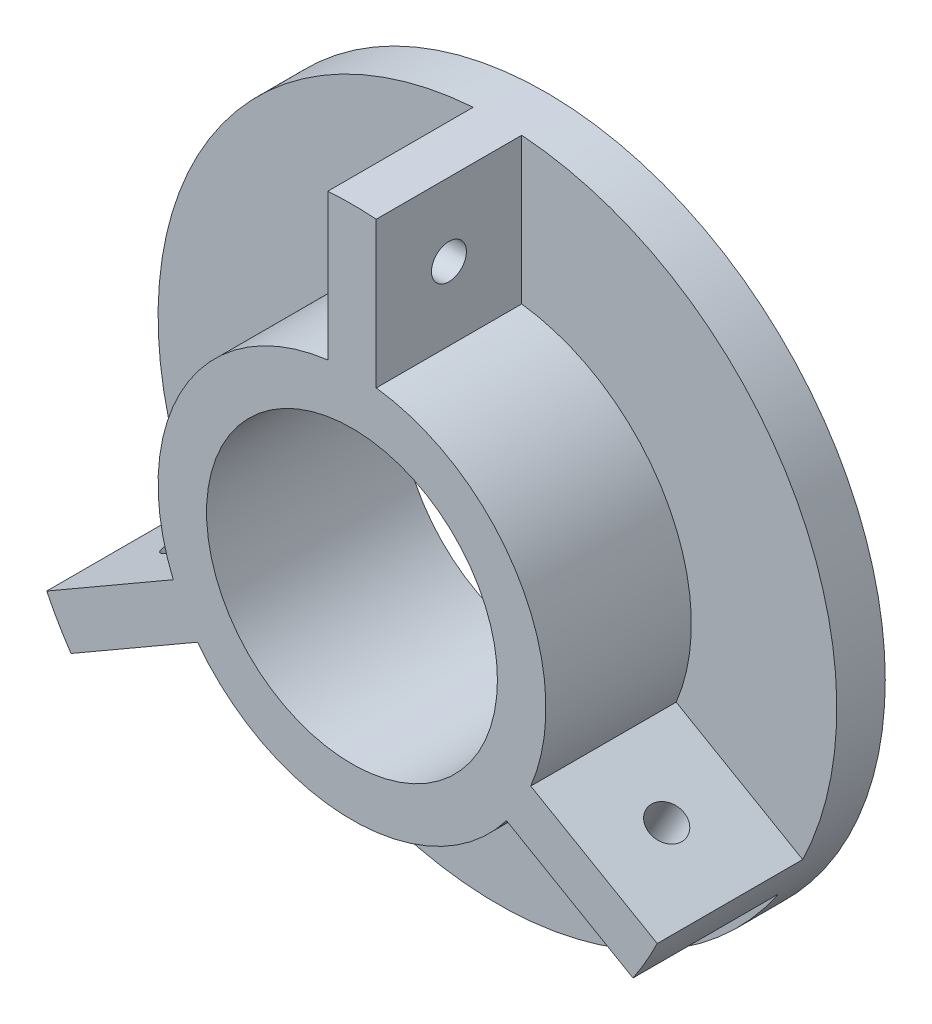
ISO-10303-21;
HEADER;
FILE_DESCRIPTION(('STEP AP214'),'2;1');
FILE_NAME('part.step','',(''),(''),'','','');
FILE_SCHEMA(('AUTOMOTIVE_DESIGN { 1 0 10303 214 1 1 1 1 }'));
ENDSEC;
DATA;
#1=APPLICATION_CONTEXT('core data for automotive mechanical design processes');
#2=APPLICATION_PROTOCOL_DEFINITION('international standard','automotive_design',2000,#1);
#3=PRODUCT_CONTEXT('',#1,'mechanical');
#4=PRODUCT('Part','Part','',(#3));
#5=PRODUCT_RELATED_PRODUCT_CATEGORY('part','',(#4));
#6=PRODUCT_DEFINITION_FORMATION('','',#4);
#7=PRODUCT_DEFINITION_CONTEXT('part definition',#1,'design');
#8=PRODUCT_DEFINITION('design','',#6,#7);
#9=PRODUCT_DEFINITION_SHAPE('','',#8);
#10=(LENGTH_UNIT() NAMED_UNIT(*) SI_UNIT(.MILLI.,.METRE.));
#11=(NAMED_UNIT(*) PLANE_ANGLE_UNIT() SI_UNIT($,.RADIAN.));
#12=(NAMED_UNIT(*) SI_UNIT($,.STERADIAN.) SOLID_ANGLE_UNIT());
#13=UNCERTAINTY_MEASURE_WITH_UNIT(LENGTH_MEASURE(1.E-05),#10,'distance_accuracy_value','');
#14=(GEOMETRIC_REPRESENTATION_CONTEXT(3) GLOBAL_UNCERTAINTY_ASSIGNED_CONTEXT((#13)) GLOBAL_UNIT_ASSIGNED_CONTEXT((#10,
#11,#12)) REPRESENTATION_CONTEXT('',''));
#15=CARTESIAN_POINT('',(0.,0.,0.));
#16=DIRECTION('',(0.,0.,1.));
#17=DIRECTION('',(1.,0.,0.));
#18=AXIS2_PLACEMENT_3D('',#15,#16,#17);
#19=CARTESIAN_POINT('',(0.,0.,5.));
#20=DIRECTION('',(0.,0.,1.));
#21=DIRECTION('',(1.,0.,0.));
#22=AXIS2_PLACEMENT_3D('',#19,#20,#21);
#23=PLANE('',#22);
#24=DIRECTION('',(0.866025403784439,-0.5,0.));
#25=VECTOR('',#24,1.);
#26=CARTESIAN_POINT('',(-1.25000000000313,-2.16506350946653,5.));
#27=LINE('',#26,#25);
#28=CARTESIAN_POINT('',(15.9337652188014,-12.0861149842338,5.));
#29=VERTEX_POINT('',#28);
#30=CARTESIAN_POINT('',(28.983466556116,-19.6203635641775,5.));
#31=VERTEX_POINT('',#30);
#32=EDGE_CURVE('E49',#29,#31,#27,.T.);
#33=ORIENTED_EDGE('',*,*,#32,.F.);
#34=CARTESIAN_POINT('',(0.,0.,5.));
#35=DIRECTION('',(0.,0.,1.));
#36=DIRECTION('',(1.,0.,0.));
#37=AXIS2_PLACEMENT_3D('',#34,#35,#36);
#38=CIRCLE('',#37,19.9989762102908);
#39=CARTESIAN_POINT('',(-15.9337652188014,-12.0861149842338,5.));
#40=VERTEX_POINT('',#39);
#41=EDGE_CURVE('E53',#40,#29,#38,.T.);
#42=ORIENTED_EDGE('',*,*,#41,.F.);
#43=DIRECTION('',(-0.866025403784438,-0.5,0.));
#44=VECTOR('',#43,1.);
#45=CARTESIAN_POINT('',(1.25000000000313,-2.16506350946652,5.));
#46=LINE('',#45,#44);
#47=CARTESIAN_POINT('',(-28.983466556116,-19.6203635641775,5.));
#48=VERTEX_POINT('',#47);
#49=EDGE_CURVE('E266',#40,#48,#46,.T.);
#50=ORIENTED_EDGE('',*,*,#49,.T.);
#51=CARTESIAN_POINT('',(0.,0.,5.));
#52=DIRECTION('',(0.,0.,1.));
#53=DIRECTION('',(1.,0.,0.));
#54=AXIS2_PLACEMENT_3D('',#51,#52,#53);
#55=CIRCLE('',#54,35.);
#56=EDGE_CURVE('E41',#48,#31,#55,.T.);
#57=ORIENTED_EDGE('',*,*,#56,.T.);
#58=EDGE_LOOP('',(#33,#42,#50,#57));
#59=FACE_BOUND('',#58,.T.);
#60=ADVANCED_FACE('F32',(#59),#23,.T.);
#61=CARTESIAN_POINT('',(18.4337652188014,-7.7559879653132,5.));
#62=VERTEX_POINT('',#61);
#63=CARTESIAN_POINT('',(2.5,19.8421029495308,5.));
#64=VERTEX_POINT('',#63);
#65=EDGE_CURVE('E146',#62,#64,#38,.T.);
#66=ORIENTED_EDGE('',*,*,#65,.F.);
#67=DIRECTION('',(0.866025403784439,-0.5,0.));
#68=VECTOR('',#67,1.);
#69=CARTESIAN_POINT('',(1.24999999999687,2.16506350945567,5.));
#70=LINE('',#69,#68);
#71=CARTESIAN_POINT('',(31.4834665561168,-15.2902365452557,5.));
#72=VERTEX_POINT('',#71);
#73=EDGE_CURVE('E173',#62,#72,#70,.T.);
#74=ORIENTED_EDGE('',*,*,#73,.T.);
#75=CARTESIAN_POINT('',(2.5,34.9106001094224,5.));
#76=VERTEX_POINT('',#75);
#77=EDGE_CURVE('E160',#72,#76,#55,.T.);
#78=ORIENTED_EDGE('',*,*,#77,.T.);
#79=DIRECTION('',(0.,1.,0.));
#80=VECTOR('',#79,1.);
#81=CARTESIAN_POINT('',(2.5,0.,5.));
#82=LINE('',#81,#80);
#83=EDGE_CURVE('E171',#64,#76,#82,.T.);
#84=ORIENTED_EDGE('',*,*,#83,.F.);
#85=EDGE_LOOP('',(#66,#74,#78,#84));
#86=FACE_BOUND('',#85,.T.);
#87=ADVANCED_FACE('F170',(#86),#23,.T.);
#88=DIRECTION('',(-0.866025403784438,-0.500000000000001,0.));
#89=VECTOR('',#88,1.);
#90=CARTESIAN_POINT('',(-1.24999999999687,2.16506350945567,5.));
#91=LINE('',#90,#89);
#92=CARTESIAN_POINT('',(-18.4337652188014,-7.75598796531321,5.));
#93=VERTEX_POINT('',#92);
#94=CARTESIAN_POINT('',(-31.4834665561168,-15.2902365452557,5.));
#95=VERTEX_POINT('',#94);
#96=EDGE_CURVE('E245',#93,#95,#91,.T.);
#97=ORIENTED_EDGE('',*,*,#96,.F.);
#98=CARTESIAN_POINT('',(-2.5,19.8421029495308,5.));
#99=VERTEX_POINT('',#98);
#100=EDGE_CURVE('E203',#99,#93,#38,.T.);
#101=ORIENTED_EDGE('',*,*,#100,.F.);
#102=DIRECTION('',(0.,1.,0.));
#103=VECTOR('',#102,1.);
#104=CARTESIAN_POINT('',(-2.5,0.,5.));
#105=LINE('',#104,#103);
#106=CARTESIAN_POINT('',(-2.5,34.9106001094224,5.));
#107=VERTEX_POINT('',#106);
#108=EDGE_CURVE('E177',#99,#107,#105,.T.);
#109=ORIENTED_EDGE('',*,*,#108,.T.);
#110=EDGE_CURVE('E11',#107,#95,#55,.T.);
#111=ORIENTED_EDGE('',*,*,#110,.T.);
#112=EDGE_LOOP('',(#97,#101,#109,#111));
#113=FACE_BOUND('',#112,.T.);
#114=ADVANCED_FACE('F305',(#113),#23,.T.);
#115=CARTESIAN_POINT('',(0.,0.,0.));
#116=DIRECTION('',(0.,0.,1.));
#117=DIRECTION('',(1.,0.,0.));
#118=AXIS2_PLACEMENT_3D('',#115,#116,#117);
#119=PLANE('',#118);
#120=CARTESIAN_POINT('',(0.,0.,0.));
#121=DIRECTION('',(0.,0.,1.));
#122=DIRECTION('',(1.,0.,0.));
#123=AXIS2_PLACEMENT_3D('',#120,#121,#122);
#124=CIRCLE('',#123,35.);
#125=CARTESIAN_POINT('',(35.,0.,0.));
#126=VERTEX_POINT('',#125);
#127=EDGE_CURVE('E150',#126,#126,#124,.T.);
#128=ORIENTED_EDGE('',*,*,#127,.F.);
#129=EDGE_LOOP('',(#128));
#130=FACE_BOUND('',#129,.T.);
#131=CARTESIAN_POINT('',(0.,0.,0.));
#132=DIRECTION('',(0.,0.,1.));
#133=DIRECTION('',(1.,0.,0.));
#134=AXIS2_PLACEMENT_3D('',#131,#132,#133);
#135=CIRCLE('',#134,15.);
#136=CARTESIAN_POINT('',(15.,0.,0.));
#137=VERTEX_POINT('',#136);
#138=EDGE_CURVE('E147',#137,#137,#135,.T.);
#139=ORIENTED_EDGE('',*,*,#138,.T.);
#140=EDGE_LOOP('',(#139));
#141=FACE_BOUND('',#140,.T.);
#142=ADVANCED_FACE('F311',(#130,#141),#119,.F.);
#143=CARTESIAN_POINT('',(0.,0.,5.));
#144=DIRECTION('',(0.,0.,-1.));
#145=DIRECTION('',(-1.,0.,0.));
#146=AXIS2_PLACEMENT_3D('',#143,#144,#145);
#147=CYLINDRICAL_SURFACE('',#146,35.);
#148=ORIENTED_EDGE('',*,*,#110,.F.);
#149=DIRECTION('',(0.,0.,-1.));
#150=VECTOR('',#149,1.);
#151=CARTESIAN_POINT('',(-2.5,34.9106001094224,20.));
#152=LINE('',#151,#150);
#153=CARTESIAN_POINT('',(-2.5,34.9106001094224,20.));
#154=VERTEX_POINT('',#153);
#155=EDGE_CURVE('E152',#154,#107,#152,.T.);
#156=ORIENTED_EDGE('',*,*,#155,.F.);
#157=CARTESIAN_POINT('',(0.,0.,20.));
#158=DIRECTION('',(0.,0.,1.));
#159=DIRECTION('',(1.,0.,0.));
#160=AXIS2_PLACEMENT_3D('',#157,#158,#159);
#161=CIRCLE('',#160,35.);
#162=CARTESIAN_POINT('',(2.5,34.9106001094224,20.));
#163=VERTEX_POINT('',#162);
#164=EDGE_CURVE('E131',#163,#154,#161,.T.);
#165=ORIENTED_EDGE('',*,*,#164,.F.);
#166=DIRECTION('',(0.,0.,-1.));
#167=VECTOR('',#166,1.);
#168=CARTESIAN_POINT('',(2.5,34.9106001094224,20.));
#169=LINE('',#168,#167);
#170=EDGE_CURVE('E128',#163,#76,#169,.T.);
#171=ORIENTED_EDGE('',*,*,#170,.T.);
#172=ORIENTED_EDGE('',*,*,#77,.F.);
#173=DIRECTION('',(0.,0.,-1.));
#174=VECTOR('',#173,1.);
#175=CARTESIAN_POINT('',(31.4834665561168,-15.2902365452557,20.));
#176=LINE('',#175,#174);
#177=CARTESIAN_POINT('',(31.4834665561168,-15.2902365452557,20.));
#178=VERTEX_POINT('',#177);
#179=EDGE_CURVE('E214',#178,#72,#176,.T.);
#180=ORIENTED_EDGE('',*,*,#179,.F.);
#181=CARTESIAN_POINT('',(0.,0.,20.));
#182=DIRECTION('',(0.,0.,1.));
#183=DIRECTION('',(1.,0.,0.));
#184=AXIS2_PLACEMENT_3D('',#181,#182,#183);
#185=CIRCLE('',#184,35.);
#186=CARTESIAN_POINT('',(28.983466556116,-19.6203635641775,20.));
#187=VERTEX_POINT('',#186);
#188=EDGE_CURVE('E197',#187,#178,#185,.T.);
#189=ORIENTED_EDGE('',*,*,#188,.F.);
#190=DIRECTION('',(0.,0.,-1.));
#191=VECTOR('',#190,1.);
#192=CARTESIAN_POINT('',(28.983466556116,-19.6203635641775,20.));
#193=LINE('',#192,#191);
#194=EDGE_CURVE('E216',#187,#31,#193,.T.);
#195=ORIENTED_EDGE('',*,*,#194,.T.);
#196=ORIENTED_EDGE('',*,*,#56,.F.);
#197=DIRECTION('',(0.,0.,-1.));
#198=VECTOR('',#197,1.);
#199=CARTESIAN_POINT('',(-28.983466556116,-19.6203635641775,20.));
#200=LINE('',#199,#198);
#201=CARTESIAN_POINT('',(-28.983466556116,-19.6203635641775,20.));
#202=VERTEX_POINT('',#201);
#203=EDGE_CURVE('E228',#202,#48,#200,.T.);
#204=ORIENTED_EDGE('',*,*,#203,.F.);
#205=CARTESIAN_POINT('',(0.,0.,20.));
#206=DIRECTION('',(0.,0.,1.));
#207=DIRECTION('',(1.,0.,0.));
#208=AXIS2_PLACEMENT_3D('',#205,#206,#207);
#209=CIRCLE('',#208,35.);
#210=CARTESIAN_POINT('',(-31.4834665561168,-15.2902365452558,20.));
#211=VERTEX_POINT('',#210);
#212=EDGE_CURVE('E190',#211,#202,#209,.T.);
#213=ORIENTED_EDGE('',*,*,#212,.F.);
#214=DIRECTION('',(0.,0.,-1.));
#215=VECTOR('',#214,1.);
#216=CARTESIAN_POINT('',(-31.4834665561168,-15.2902365452558,20.));
#217=LINE('',#216,#215);
#218=EDGE_CURVE('E231',#211,#95,#217,.T.);
#219=ORIENTED_EDGE('',*,*,#218,.T.);
#220=EDGE_LOOP('',(#148,#156,#165,#171,#172,#180,#189,#195,#196,#204,#213,#219));
#221=FACE_BOUND('',#220,.T.);
#222=ORIENTED_EDGE('',*,*,#127,.T.);
#223=EDGE_LOOP('',(#222));
#224=FACE_BOUND('',#223,.T.);
#225=ADVANCED_FACE('F34',(#221,#224),#147,.T.);
#226=CARTESIAN_POINT('',(0.,0.,5.));
#227=DIRECTION('',(0.,0.,-1.));
#228=DIRECTION('',(-1.,0.,0.));
#229=AXIS2_PLACEMENT_3D('',#226,#227,#228);
#230=CYLINDRICAL_SURFACE('',#229,15.);
#231=ORIENTED_EDGE('',*,*,#138,.F.);
#232=EDGE_LOOP('',(#231));
#233=FACE_BOUND('',#232,.T.);
#234=CARTESIAN_POINT('',(0.,0.,20.));
#235=DIRECTION('',(0.,0.,1.));
#236=DIRECTION('',(1.,0.,0.));
#237=AXIS2_PLACEMENT_3D('',#234,#235,#236);
#238=CIRCLE('',#237,15.);
#239=CARTESIAN_POINT('',(15.,0.,20.));
#240=VERTEX_POINT('',#239);
#241=EDGE_CURVE('E141',#240,#240,#238,.F.);
#242=ORIENTED_EDGE('',*,*,#241,.F.);
#243=EDGE_LOOP('',(#242));
#244=FACE_BOUND('',#243,.T.);
#245=ADVANCED_FACE('F342',(#233,#244),#230,.F.);
#246=CARTESIAN_POINT('',(0.,0.,20.));
#247=DIRECTION('',(0.,0.,-1.));
#248=DIRECTION('',(-1.,0.,0.));
#249=AXIS2_PLACEMENT_3D('',#246,#247,#248);
#250=CYLINDRICAL_SURFACE('',#249,19.9989762102908);
#251=ORIENTED_EDGE('',*,*,#65,.T.);
#252=DIRECTION('',(0.,0.,-1.));
#253=VECTOR('',#252,1.);
#254=CARTESIAN_POINT('',(2.5,19.8421029495308,20.));
#255=LINE('',#254,#253);
#256=CARTESIAN_POINT('',(2.5,19.8421029495308,20.));
#257=VERTEX_POINT('',#256);
#258=EDGE_CURVE('E125',#257,#64,#255,.T.);
#259=ORIENTED_EDGE('',*,*,#258,.F.);
#260=CARTESIAN_POINT('',(0.,0.,20.));
#261=DIRECTION('',(0.,0.,1.));
#262=DIRECTION('',(1.,0.,0.));
#263=AXIS2_PLACEMENT_3D('',#260,#261,#262);
#264=CIRCLE('',#263,19.9989762102908);
#265=CARTESIAN_POINT('',(18.4337652188014,-7.7559879653132,20.));
#266=VERTEX_POINT('',#265);
#267=EDGE_CURVE('E132',#266,#257,#264,.T.);
#268=ORIENTED_EDGE('',*,*,#267,.F.);
#269=DIRECTION('',(0.,0.,-1.));
#270=VECTOR('',#269,1.);
#271=CARTESIAN_POINT('',(18.4337652188014,-7.7559879653132,20.));
#272=LINE('',#271,#270);
#273=EDGE_CURVE('E200',#266,#62,#272,.T.);
#274=ORIENTED_EDGE('',*,*,#273,.T.);
#275=EDGE_LOOP('',(#251,#259,#268,#274));
#276=FACE_BOUND('',#275,.T.);
#277=ADVANCED_FACE('F145',(#276),#250,.T.);
#278=CARTESIAN_POINT('',(2.5,0.,20.));
#279=DIRECTION('',(-1.,0.,0.));
#280=DIRECTION('',(0.,0.,1.));
#281=AXIS2_PLACEMENT_3D('',#278,#279,#280);
#282=PLANE('',#281);
#283=CARTESIAN_POINT('',(2.5,27.3763515294766,12.5));
#284=DIRECTION('',(1.,0.,0.));
#285=DIRECTION('',(0.,0.,-1.));
#286=AXIS2_PLACEMENT_3D('',#283,#284,#285);
#287=CIRCLE('',#286,1.8);
#288=CARTESIAN_POINT('',(2.5,27.3763515294766,10.7));
#289=VERTEX_POINT('',#288);
#290=EDGE_CURVE('E202',#289,#289,#287,.T.);
#291=ORIENTED_EDGE('',*,*,#290,.F.);
#292=EDGE_LOOP('',(#291));
#293=FACE_BOUND('',#292,.T.);
#294=ORIENTED_EDGE('',*,*,#83,.T.);
#295=ORIENTED_EDGE('',*,*,#170,.F.);
#296=DIRECTION('',(0.,1.,0.));
#297=VECTOR('',#296,1.);
#298=CARTESIAN_POINT('',(2.5,0.,20.));
#299=LINE('',#298,#297);
#300=EDGE_CURVE('E120',#257,#163,#299,.T.);
#301=ORIENTED_EDGE('',*,*,#300,.F.);
#302=ORIENTED_EDGE('',*,*,#258,.T.);
#303=EDGE_LOOP('',(#294,#295,#301,#302));
#304=FACE_BOUND('',#303,.T.);
#305=ADVANCED_FACE('F123',(#293,#304),#282,.F.);
#306=CARTESIAN_POINT('',(-2.5,0.,20.));
#307=DIRECTION('',(-1.,0.,0.));
#308=DIRECTION('',(0.,0.,1.));
#309=AXIS2_PLACEMENT_3D('',#306,#307,#308);
#310=PLANE('',#309);
#311=CARTESIAN_POINT('',(-2.5,27.3763515294766,12.5));
#312=DIRECTION('',(-1.,0.,0.));
#313=DIRECTION('',(0.,0.,1.));
#314=AXIS2_PLACEMENT_3D('',#311,#312,#313);
#315=CIRCLE('',#314,1.8);
#316=CARTESIAN_POINT('',(-2.5,27.3763515294766,14.3));
#317=VERTEX_POINT('',#316);
#318=EDGE_CURVE('E273',#317,#317,#315,.F.);
#319=ORIENTED_EDGE('',*,*,#318,.T.);
#320=EDGE_LOOP('',(#319));
#321=FACE_BOUND('',#320,.T.);
#322=ORIENTED_EDGE('',*,*,#108,.F.);
#323=DIRECTION('',(0.,0.,-1.));
#324=VECTOR('',#323,1.);
#325=CARTESIAN_POINT('',(-2.5,19.8421029495308,20.));
#326=LINE('',#325,#324);
#327=CARTESIAN_POINT('',(-2.5,19.8421029495308,20.));
#328=VERTEX_POINT('',#327);
#329=EDGE_CURVE('E155',#328,#99,#326,.T.);
#330=ORIENTED_EDGE('',*,*,#329,.F.);
#331=DIRECTION('',(0.,1.,0.));
#332=VECTOR('',#331,1.);
#333=CARTESIAN_POINT('',(-2.5,0.,20.));
#334=LINE('',#333,#332);
#335=EDGE_CURVE('E184',#328,#154,#334,.T.);
#336=ORIENTED_EDGE('',*,*,#335,.T.);
#337=ORIENTED_EDGE('',*,*,#155,.T.);
#338=EDGE_LOOP('',(#322,#330,#336,#337));
#339=FACE_BOUND('',#338,.T.);
#340=ADVANCED_FACE('F253',(#321,#339),#310,.T.);
#341=ORIENTED_EDGE('',*,*,#100,.T.);
#342=DIRECTION('',(0.,0.,-1.));
#343=VECTOR('',#342,1.);
#344=CARTESIAN_POINT('',(-18.4337652188014,-7.75598796531321,20.));
#345=LINE('',#344,#343);
#346=CARTESIAN_POINT('',(-18.4337652188014,-7.75598796531321,20.));
#347=VERTEX_POINT('',#346);
#348=EDGE_CURVE('E229',#347,#93,#345,.T.);
#349=ORIENTED_EDGE('',*,*,#348,.F.);
#350=EDGE_CURVE('E144',#328,#347,#264,.T.);
#351=ORIENTED_EDGE('',*,*,#350,.F.);
#352=ORIENTED_EDGE('',*,*,#329,.T.);
#353=EDGE_LOOP('',(#341,#349,#351,#352));
#354=FACE_BOUND('',#353,.T.);
#355=ADVANCED_FACE('F257',(#354),#250,.T.);
#356=CARTESIAN_POINT('',(-1.24999999999687,2.16506350945567,20.));
#357=DIRECTION('',(0.500000000000001,-0.866025403784438,0.));
#358=DIRECTION('',(0.866025403784438,0.500000000000001,0.));
#359=AXIS2_PLACEMENT_3D('',#356,#357,#358);
#360=PLANE('',#359);
#361=CARTESIAN_POINT('',(-24.9586158874598,-11.5231122552769,12.5));
#362=DIRECTION('',(-0.499999999999992,0.866025403784443,0.));
#363=DIRECTION('',(0.,0.,-1.));
#364=AXIS2_PLACEMENT_3D('',#361,#362,#363);
#365=CIRCLE('',#364,1.8);
#366=CARTESIAN_POINT('',(-24.9586158874598,-11.5231122552769,10.7));
#367=VERTEX_POINT('',#366);
#368=EDGE_CURVE('E282',#367,#367,#365,.T.);
#369=ORIENTED_EDGE('',*,*,#368,.F.);
#370=EDGE_LOOP('',(#369));
#371=FACE_BOUND('',#370,.T.);
#372=ORIENTED_EDGE('',*,*,#96,.T.);
#373=ORIENTED_EDGE('',*,*,#218,.F.);
#374=DIRECTION('',(-0.866025403784438,-0.500000000000001,0.));
#375=VECTOR('',#374,1.);
#376=CARTESIAN_POINT('',(-1.24999999999687,2.16506350945567,20.));
#377=LINE('',#376,#375);
#378=EDGE_CURVE('E188',#347,#211,#377,.T.);
#379=ORIENTED_EDGE('',*,*,#378,.F.);
#380=ORIENTED_EDGE('',*,*,#348,.T.);
#381=EDGE_LOOP('',(#372,#373,#379,#380));
#382=FACE_BOUND('',#381,.T.);
#383=ADVANCED_FACE('F258',(#371,#382),#360,.F.);
#384=CARTESIAN_POINT('',(1.25000000000313,-2.16506350946652,20.));
#385=DIRECTION('',(0.5,-0.866025403784438,0.));
#386=DIRECTION('',(0.866025403784438,0.5,0.));
#387=AXIS2_PLACEMENT_3D('',#384,#385,#386);
#388=PLANE('',#387);
#389=CARTESIAN_POINT('',(-22.4586158874565,-15.8532392742048,12.5));
#390=DIRECTION('',(0.5,-0.866025403784438,0.));
#391=DIRECTION('',(0.866025403784438,0.5,0.));
#392=AXIS2_PLACEMENT_3D('',#389,#390,#391);
#393=CIRCLE('',#392,1.8);
#394=CARTESIAN_POINT('',(-20.8997701606446,-14.9532392742048,12.5));
#395=VERTEX_POINT('',#394);
#396=EDGE_CURVE('E285',#395,#395,#393,.F.);
#397=ORIENTED_EDGE('',*,*,#396,.T.);
#398=EDGE_LOOP('',(#397));
#399=FACE_BOUND('',#398,.T.);
#400=ORIENTED_EDGE('',*,*,#49,.F.);
#401=DIRECTION('',(0.,0.,-1.));
#402=VECTOR('',#401,1.);
#403=CARTESIAN_POINT('',(-15.9337652188014,-12.0861149842338,20.));
#404=LINE('',#403,#402);
#405=CARTESIAN_POINT('',(-15.9337652188014,-12.0861149842338,20.));
#406=VERTEX_POINT('',#405);
#407=EDGE_CURVE('E227',#406,#40,#404,.T.);
#408=ORIENTED_EDGE('',*,*,#407,.F.);
#409=DIRECTION('',(-0.866025403784438,-0.5,0.));
#410=VECTOR('',#409,1.);
#411=CARTESIAN_POINT('',(1.25000000000313,-2.16506350946652,20.));
#412=LINE('',#411,#410);
#413=EDGE_CURVE('E192',#406,#202,#412,.T.);
#414=ORIENTED_EDGE('',*,*,#413,.T.);
#415=ORIENTED_EDGE('',*,*,#203,.T.);
#416=EDGE_LOOP('',(#400,#408,#414,#415));
#417=FACE_BOUND('',#416,.T.);
#418=ADVANCED_FACE('F265',(#399,#417),#388,.T.);
#419=ORIENTED_EDGE('',*,*,#41,.T.);
#420=DIRECTION('',(0.,0.,-1.));
#421=VECTOR('',#420,1.);
#422=CARTESIAN_POINT('',(15.9337652188014,-12.0861149842338,20.));
#423=LINE('',#422,#421);
#424=CARTESIAN_POINT('',(15.9337652188014,-12.0861149842338,20.));
#425=VERTEX_POINT('',#424);
#426=EDGE_CURVE('E224',#425,#29,#423,.T.);
#427=ORIENTED_EDGE('',*,*,#426,.F.);
#428=EDGE_CURVE('E143',#406,#425,#264,.T.);
#429=ORIENTED_EDGE('',*,*,#428,.F.);
#430=ORIENTED_EDGE('',*,*,#407,.T.);
#431=EDGE_LOOP('',(#419,#427,#429,#430));
#432=FACE_BOUND('',#431,.T.);
#433=ADVANCED_FACE('F268',(#432),#250,.T.);
#434=CARTESIAN_POINT('',(-1.25000000000313,-2.16506350946653,20.));
#435=DIRECTION('',(0.5,0.866025403784439,0.));
#436=DIRECTION('',(-0.866025403784439,0.5,0.));
#437=AXIS2_PLACEMENT_3D('',#434,#435,#436);
#438=PLANE('',#437);
#439=CARTESIAN_POINT('',(22.4586158874596,-15.8532392741995,12.5));
#440=DIRECTION('',(-0.500000000000004,-0.866025403784436,0.));
#441=DIRECTION('',(0.,0.,-1.));
#442=AXIS2_PLACEMENT_3D('',#439,#440,#441);
#443=CIRCLE('',#442,1.8);
#444=CARTESIAN_POINT('',(22.4586158874596,-15.8532392741995,10.7));
#445=VERTEX_POINT('',#444);
#446=EDGE_CURVE('E276',#445,#445,#443,.T.);
#447=ORIENTED_EDGE('',*,*,#446,.F.);
#448=EDGE_LOOP('',(#447));
#449=FACE_BOUND('',#448,.T.);
#450=ORIENTED_EDGE('',*,*,#32,.T.);
#451=ORIENTED_EDGE('',*,*,#194,.F.);
#452=DIRECTION('',(0.866025403784439,-0.5,0.));
#453=VECTOR('',#452,1.);
#454=CARTESIAN_POINT('',(-1.25000000000313,-2.16506350946653,20.));
#455=LINE('',#454,#453);
#456=EDGE_CURVE('E195',#425,#187,#455,.T.);
#457=ORIENTED_EDGE('',*,*,#456,.F.);
#458=ORIENTED_EDGE('',*,*,#426,.T.);
#459=EDGE_LOOP('',(#450,#451,#457,#458));
#460=FACE_BOUND('',#459,.T.);
#461=ADVANCED_FACE('F319',(#449,#460),#438,.F.);
#462=CARTESIAN_POINT('',(1.24999999999687,2.16506350945567,20.));
#463=DIRECTION('',(0.5,0.866025403784439,0.));
#464=DIRECTION('',(-0.866025403784439,0.5,0.));
#465=AXIS2_PLACEMENT_3D('',#462,#463,#464);
#466=PLANE('',#465);
#467=CARTESIAN_POINT('',(24.9586158874565,-11.5231122552826,12.5));
#468=DIRECTION('',(0.5,0.866025403784439,0.));
#469=DIRECTION('',(-0.866025403784439,0.5,0.));
#470=AXIS2_PLACEMENT_3D('',#467,#468,#469);
#471=CIRCLE('',#470,1.8);
#472=CARTESIAN_POINT('',(23.3997701606446,-10.6231122552826,12.5));
#473=VERTEX_POINT('',#472);
#474=EDGE_CURVE('E279',#473,#473,#471,.F.);
#475=ORIENTED_EDGE('',*,*,#474,.T.);
#476=EDGE_LOOP('',(#475));
#477=FACE_BOUND('',#476,.T.);
#478=ORIENTED_EDGE('',*,*,#73,.F.);
#479=ORIENTED_EDGE('',*,*,#273,.F.);
#480=DIRECTION('',(0.866025403784439,-0.5,0.));
#481=VECTOR('',#480,1.);
#482=CARTESIAN_POINT('',(1.24999999999687,2.16506350945567,20.));
#483=LINE('',#482,#481);
#484=EDGE_CURVE('E138',#266,#178,#483,.T.);
#485=ORIENTED_EDGE('',*,*,#484,.T.);
#486=ORIENTED_EDGE('',*,*,#179,.T.);
#487=EDGE_LOOP('',(#478,#479,#485,#486));
#488=FACE_BOUND('',#487,.T.);
#489=ADVANCED_FACE('F324',(#477,#488),#466,.T.);
#490=CARTESIAN_POINT('',(0.,0.,20.));
#491=DIRECTION('',(0.,0.,1.));
#492=DIRECTION('',(1.,0.,0.));
#493=AXIS2_PLACEMENT_3D('',#490,#491,#492);
#494=PLANE('',#493);
#495=ORIENTED_EDGE('',*,*,#241,.T.);
#496=EDGE_LOOP('',(#495));
#497=FACE_BOUND('',#496,.T.);
#498=ORIENTED_EDGE('',*,*,#267,.T.);
#499=ORIENTED_EDGE('',*,*,#300,.T.);
#500=ORIENTED_EDGE('',*,*,#164,.T.);
#501=ORIENTED_EDGE('',*,*,#335,.F.);
#502=ORIENTED_EDGE('',*,*,#350,.T.);
#503=ORIENTED_EDGE('',*,*,#378,.T.);
#504=ORIENTED_EDGE('',*,*,#212,.T.);
#505=ORIENTED_EDGE('',*,*,#413,.F.);
#506=ORIENTED_EDGE('',*,*,#428,.T.);
#507=ORIENTED_EDGE('',*,*,#456,.T.);
#508=ORIENTED_EDGE('',*,*,#188,.T.);
#509=ORIENTED_EDGE('',*,*,#484,.F.);
#510=EDGE_LOOP('',(#498,#499,#500,#501,#502,#503,#504,#505,#506,#507,#508,#509));
#511=FACE_BOUND('',#510,.T.);
#512=ADVANCED_FACE('F136',(#497,#511),#494,.T.);
#513=CARTESIAN_POINT('',(-35.001025,27.3763515294766,12.5));
#514=DIRECTION('',(1.,0.,0.));
#515=DIRECTION('',(0.,0.,-1.));
#516=AXIS2_PLACEMENT_3D('',#513,#514,#515);
#517=CYLINDRICAL_SURFACE('',#516,1.8);
#518=ORIENTED_EDGE('',*,*,#318,.F.);
#519=EDGE_LOOP('',(#518));
#520=FACE_BOUND('',#519,.T.);
#521=ORIENTED_EDGE('',*,*,#290,.T.);
#522=EDGE_LOOP('',(#521));
#523=FACE_BOUND('',#522,.T.);
#524=ADVANCED_FACE('F332',(#520,#523),#517,.F.);
#525=CARTESIAN_POINT('',(47.6147497163894,27.7184626395087,12.5));
#526=DIRECTION('',(-0.500000000000004,-0.866025403784436,0.));
#527=DIRECTION('',(0.866025403784436,-0.500000000000004,0.));
#528=AXIS2_PLACEMENT_3D('',#525,#526,#527);
#529=CYLINDRICAL_SURFACE('',#528,1.8);
#530=ORIENTED_EDGE('',*,*,#474,.F.);
#531=EDGE_LOOP('',(#530));
#532=FACE_BOUND('',#531,.T.);
#533=ORIENTED_EDGE('',*,*,#446,.T.);
#534=EDGE_LOOP('',(#533));
#535=FACE_BOUND('',#534,.T.);
#536=ADVANCED_FACE('F363',(#532,#535),#529,.F.);
#537=CARTESIAN_POINT('',(0.197528766786879,-55.0948329189853,12.5));
#538=DIRECTION('',(-0.499999999999992,0.866025403784443,0.));
#539=DIRECTION('',(-0.866025403784443,-0.499999999999992,0.));
#540=AXIS2_PLACEMENT_3D('',#537,#538,#539);
#541=CYLINDRICAL_SURFACE('',#540,1.8);
#542=ORIENTED_EDGE('',*,*,#396,.F.);
#543=EDGE_LOOP('',(#542));
#544=FACE_BOUND('',#543,.T.);
#545=ORIENTED_EDGE('',*,*,#368,.T.);
#546=EDGE_LOOP('',(#545));
#547=FACE_BOUND('',#546,.T.);
#548=ADVANCED_FACE('F291',(#544,#547),#541,.F.);
#549=CLOSED_SHELL('',(#60,#87,#114,#142,#225,#245,#277,#305,#340,#355,#383,#418,#433,#461,#489,
#512,#524,#536,#548));
#550=MANIFOLD_SOLID_BREP('B2',#549);
#551=ADVANCED_BREP_SHAPE_REPRESENTATION('',(#18,#550),#14);
#552=SHAPE_DEFINITION_REPRESENTATION(#9,#551);
ENDSEC;
END-ISO-10303-21;
